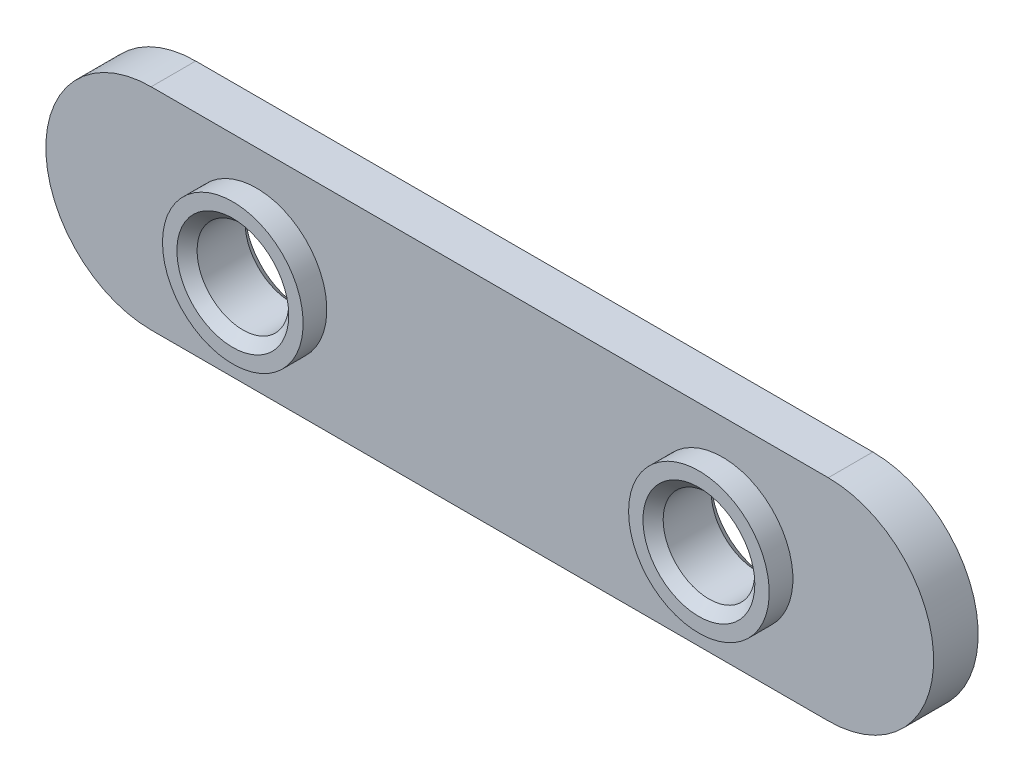
ISO-10303-21;
HEADER;
FILE_DESCRIPTION(('STEP AP214'),'2;1');
FILE_NAME('part.step','',(''),(''),'','','');
FILE_SCHEMA(('AUTOMOTIVE_DESIGN { 1 0 10303 214 1 1 1 1 }'));
ENDSEC;
DATA;
#1=APPLICATION_CONTEXT('core data for automotive mechanical design processes');
#2=APPLICATION_PROTOCOL_DEFINITION('international standard','automotive_design',2000,#1);
#3=PRODUCT_CONTEXT('',#1,'mechanical');
#4=PRODUCT('Part','Part','',(#3));
#5=PRODUCT_RELATED_PRODUCT_CATEGORY('part','',(#4));
#6=PRODUCT_DEFINITION_FORMATION('','',#4);
#7=PRODUCT_DEFINITION_CONTEXT('part definition',#1,'design');
#8=PRODUCT_DEFINITION('design','',#6,#7);
#9=PRODUCT_DEFINITION_SHAPE('','',#8);
#10=(LENGTH_UNIT() NAMED_UNIT(*) SI_UNIT(.MILLI.,.METRE.));
#11=(NAMED_UNIT(*) PLANE_ANGLE_UNIT() SI_UNIT($,.RADIAN.));
#12=(NAMED_UNIT(*) SI_UNIT($,.STERADIAN.) SOLID_ANGLE_UNIT());
#13=UNCERTAINTY_MEASURE_WITH_UNIT(LENGTH_MEASURE(1.E-05),#10,'distance_accuracy_value','');
#14=(GEOMETRIC_REPRESENTATION_CONTEXT(3) GLOBAL_UNCERTAINTY_ASSIGNED_CONTEXT((#13)) GLOBAL_UNIT_ASSIGNED_CONTEXT((#10,
#11,#12)) REPRESENTATION_CONTEXT('',''));
#15=CARTESIAN_POINT('',(0.,0.,0.));
#16=DIRECTION('',(0.,0.,1.));
#17=DIRECTION('',(1.,0.,0.));
#18=AXIS2_PLACEMENT_3D('',#15,#16,#17);
#19=CARTESIAN_POINT('',(28.7719,0.,2.465));
#20=DIRECTION('',(0.,0.,-1.));
#21=DIRECTION('',(-1.,0.,0.));
#22=AXIS2_PLACEMENT_3D('',#19,#20,#21);
#23=PLANE('',#22);
#24=CARTESIAN_POINT('',(25.,0.,2.465));
#25=DIRECTION('',(0.,0.,-1.));
#26=DIRECTION('',(-1.,0.,0.));
#27=AXIS2_PLACEMENT_3D('',#24,#25,#26);
#28=CIRCLE('',#27,3.7719);
#29=CARTESIAN_POINT('',(21.2281,0.,2.465));
#30=VERTEX_POINT('',#29);
#31=EDGE_CURVE('E124',#30,#30,#28,.T.);
#32=ORIENTED_EDGE('',*,*,#31,.F.);
#33=EDGE_LOOP('',(#32));
#34=FACE_BOUND('',#33,.T.);
#35=CARTESIAN_POINT('',(25.,0.,2.46499999991556));
#36=DIRECTION('',(0.,0.,1.));
#37=DIRECTION('',(1.,0.,0.));
#38=AXIS2_PLACEMENT_3D('',#35,#36,#37);
#39=CIRCLE('',#38,2.99999999996316);
#40=CARTESIAN_POINT('',(27.9999999999632,0.,2.46499999991556));
#41=VERTEX_POINT('',#40);
#42=EDGE_CURVE('E19',#41,#41,#39,.F.);
#43=ORIENTED_EDGE('',*,*,#42,.T.);
#44=EDGE_LOOP('',(#43));
#45=FACE_BOUND('',#44,.T.);
#46=ADVANCED_FACE('F16',(#34,#45),#23,.F.);
#47=CARTESIAN_POINT('',(3.7719,0.,2.465));
#48=DIRECTION('',(0.,0.,-1.));
#49=DIRECTION('',(-1.,0.,0.));
#50=AXIS2_PLACEMENT_3D('',#47,#48,#49);
#51=PLANE('',#50);
#52=CARTESIAN_POINT('',(0.,0.,2.465));
#53=DIRECTION('',(0.,0.,-1.));
#54=DIRECTION('',(-1.,0.,0.));
#55=AXIS2_PLACEMENT_3D('',#52,#53,#54);
#56=CIRCLE('',#55,3.7719);
#57=CARTESIAN_POINT('',(-3.7719,0.,2.465));
#58=VERTEX_POINT('',#57);
#59=EDGE_CURVE('E104',#58,#58,#56,.T.);
#60=ORIENTED_EDGE('',*,*,#59,.F.);
#61=EDGE_LOOP('',(#60));
#62=FACE_BOUND('',#61,.T.);
#63=CARTESIAN_POINT('',(0.,0.,2.46499999997241));
#64=DIRECTION('',(0.,0.,1.));
#65=DIRECTION('',(1.,0.,0.));
#66=AXIS2_PLACEMENT_3D('',#63,#64,#65);
#67=CIRCLE('',#66,3.00000000004275);
#68=CARTESIAN_POINT('',(3.00000000004275,0.,2.46499999997241));
#69=VERTEX_POINT('',#68);
#70=EDGE_CURVE('E126',#69,#69,#67,.F.);
#71=ORIENTED_EDGE('',*,*,#70,.T.);
#72=EDGE_LOOP('',(#71));
#73=FACE_BOUND('',#72,.T.);
#74=ADVANCED_FACE('F137',(#62,#73),#51,.F.);
#75=CARTESIAN_POINT('',(25.,0.,2.46499999985872));
#76=DIRECTION('',(0.,0.,1.));
#77=DIRECTION('',(1.,0.,0.));
#78=AXIS2_PLACEMENT_3D('',#75,#76,#77);
#79=CONICAL_SURFACE('',#78,2.99999999990632,0.785398163397448);
#80=CARTESIAN_POINT('',(25.,0.,1.9235));
#81=DIRECTION('',(0.,0.,-1.));
#82=DIRECTION('',(-1.,0.,0.));
#83=AXIS2_PLACEMENT_3D('',#80,#81,#82);
#84=CIRCLE('',#83,2.4585);
#85=CARTESIAN_POINT('',(22.5415,0.,1.9235));
#86=VERTEX_POINT('',#85);
#87=EDGE_CURVE('E99',#86,#86,#84,.T.);
#88=ORIENTED_EDGE('',*,*,#87,.T.);
#89=EDGE_LOOP('',(#88));
#90=FACE_BOUND('',#89,.T.);
#91=ORIENTED_EDGE('',*,*,#42,.F.);
#92=EDGE_LOOP('',(#91));
#93=FACE_BOUND('',#92,.T.);
#94=ADVANCED_FACE('F134',(#90,#93),#79,.F.);
#95=CARTESIAN_POINT('',(0.,0.,2.46499999985872));
#96=DIRECTION('',(0.,0.,1.));
#97=DIRECTION('',(1.,0.,0.));
#98=AXIS2_PLACEMENT_3D('',#95,#96,#97);
#99=CONICAL_SURFACE('',#98,2.99999999992906,0.785398163397448);
#100=CARTESIAN_POINT('',(0.,0.,1.9235));
#101=DIRECTION('',(0.,0.,-1.));
#102=DIRECTION('',(-1.,0.,0.));
#103=AXIS2_PLACEMENT_3D('',#100,#101,#102);
#104=CIRCLE('',#103,2.4585);
#105=CARTESIAN_POINT('',(-2.4585,0.,1.9235));
#106=VERTEX_POINT('',#105);
#107=EDGE_CURVE('E95',#106,#106,#104,.T.);
#108=ORIENTED_EDGE('',*,*,#107,.T.);
#109=EDGE_LOOP('',(#108));
#110=FACE_BOUND('',#109,.T.);
#111=ORIENTED_EDGE('',*,*,#70,.F.);
#112=EDGE_LOOP('',(#111));
#113=FACE_BOUND('',#112,.T.);
#114=ADVANCED_FACE('F136',(#110,#113),#99,.F.);
#115=CARTESIAN_POINT('',(25.,0.,2.465));
#116=DIRECTION('',(0.,0.,-1.));
#117=DIRECTION('',(-1.,0.,0.));
#118=AXIS2_PLACEMENT_3D('',#115,#116,#117);
#119=CYLINDRICAL_SURFACE('',#118,3.7719);
#120=CARTESIAN_POINT('',(25.,0.,1.195));
#121=DIRECTION('',(0.,0.,-1.));
#122=DIRECTION('',(-1.,0.,0.));
#123=AXIS2_PLACEMENT_3D('',#120,#121,#122);
#124=CIRCLE('',#123,3.7719);
#125=CARTESIAN_POINT('',(21.2281,0.,1.195));
#126=VERTEX_POINT('',#125);
#127=EDGE_CURVE('E98',#126,#126,#124,.T.);
#128=ORIENTED_EDGE('',*,*,#127,.F.);
#129=EDGE_LOOP('',(#128));
#130=FACE_BOUND('',#129,.T.);
#131=ORIENTED_EDGE('',*,*,#31,.T.);
#132=EDGE_LOOP('',(#131));
#133=FACE_BOUND('',#132,.T.);
#134=ADVANCED_FACE('F145',(#130,#133),#119,.T.);
#135=CARTESIAN_POINT('',(0.,0.,2.465));
#136=DIRECTION('',(0.,0.,-1.));
#137=DIRECTION('',(-1.,0.,0.));
#138=AXIS2_PLACEMENT_3D('',#135,#136,#137);
#139=CYLINDRICAL_SURFACE('',#138,3.7719);
#140=CARTESIAN_POINT('',(0.,0.,1.195));
#141=DIRECTION('',(0.,0.,-1.));
#142=DIRECTION('',(-1.,0.,0.));
#143=AXIS2_PLACEMENT_3D('',#140,#141,#142);
#144=CIRCLE('',#143,3.7719);
#145=CARTESIAN_POINT('',(-3.7719,0.,1.195));
#146=VERTEX_POINT('',#145);
#147=EDGE_CURVE('E90',#146,#146,#144,.T.);
#148=ORIENTED_EDGE('',*,*,#147,.F.);
#149=EDGE_LOOP('',(#148));
#150=FACE_BOUND('',#149,.T.);
#151=ORIENTED_EDGE('',*,*,#59,.T.);
#152=EDGE_LOOP('',(#151));
#153=FACE_BOUND('',#152,.T.);
#154=ADVANCED_FACE('F186',(#150,#153),#139,.T.);
#155=CARTESIAN_POINT('',(25.,0.,2.465));
#156=DIRECTION('',(0.,0.,-1.));
#157=DIRECTION('',(-1.,0.,0.));
#158=AXIS2_PLACEMENT_3D('',#155,#156,#157);
#159=CYLINDRICAL_SURFACE('',#158,2.4585);
#160=CARTESIAN_POINT('',(25.,0.,-0.653499999941687));
#161=DIRECTION('',(0.,0.,-1.));
#162=DIRECTION('',(-1.,0.,0.));
#163=AXIS2_PLACEMENT_3D('',#160,#161,#162);
#164=CIRCLE('',#163,2.45850000001156);
#165=CARTESIAN_POINT('',(22.5414999999884,0.,-0.653499999941687));
#166=VERTEX_POINT('',#165);
#167=EDGE_CURVE('E85',#166,#166,#164,.T.);
#168=ORIENTED_EDGE('',*,*,#167,.T.);
#169=EDGE_LOOP('',(#168));
#170=FACE_BOUND('',#169,.T.);
#171=ORIENTED_EDGE('',*,*,#87,.F.);
#172=EDGE_LOOP('',(#171));
#173=FACE_BOUND('',#172,.T.);
#174=ADVANCED_FACE('F182',(#170,#173),#159,.F.);
#175=CARTESIAN_POINT('',(0.,0.,2.465));
#176=DIRECTION('',(0.,0.,-1.));
#177=DIRECTION('',(-1.,0.,0.));
#178=AXIS2_PLACEMENT_3D('',#175,#176,#177);
#179=CYLINDRICAL_SURFACE('',#178,2.4585);
#180=CARTESIAN_POINT('',(0.,0.,-0.65349999999853));
#181=DIRECTION('',(0.,0.,-1.));
#182=DIRECTION('',(-1.,0.,0.));
#183=AXIS2_PLACEMENT_3D('',#180,#181,#182);
#184=CIRCLE('',#183,2.45850000004566);
#185=CARTESIAN_POINT('',(-2.45850000004566,0.,-0.65349999999853));
#186=VERTEX_POINT('',#185);
#187=EDGE_CURVE('E67',#186,#186,#184,.T.);
#188=ORIENTED_EDGE('',*,*,#187,.T.);
#189=EDGE_LOOP('',(#188));
#190=FACE_BOUND('',#189,.T.);
#191=ORIENTED_EDGE('',*,*,#107,.F.);
#192=EDGE_LOOP('',(#191));
#193=FACE_BOUND('',#192,.T.);
#194=ADVANCED_FACE('F179',(#190,#193),#179,.F.);
#195=CARTESIAN_POINT('',(-5.65,0.,1.195));
#196=DIRECTION('',(0.,0.,1.));
#197=DIRECTION('',(1.,0.,0.));
#198=AXIS2_PLACEMENT_3D('',#195,#196,#197);
#199=PLANE('',#198);
#200=DIRECTION('',(1.,0.,0.));
#201=VECTOR('',#200,1.);
#202=CARTESIAN_POINT('',(-5.65,-5.65,1.195));
#203=LINE('',#202,#201);
#204=CARTESIAN_POINT('',(-5.65,-5.65,1.195));
#205=VERTEX_POINT('',#204);
#206=CARTESIAN_POINT('',(30.67,-5.65,1.195));
#207=VERTEX_POINT('',#206);
#208=EDGE_CURVE('E59',#205,#207,#203,.T.);
#209=ORIENTED_EDGE('',*,*,#208,.T.);
#210=CARTESIAN_POINT('',(30.67,0.,1.195));
#211=DIRECTION('',(0.,0.,1.));
#212=DIRECTION('',(1.,0.,0.));
#213=AXIS2_PLACEMENT_3D('',#210,#211,#212);
#214=CIRCLE('',#213,5.65);
#215=CARTESIAN_POINT('',(30.67,5.65,1.195));
#216=VERTEX_POINT('',#215);
#217=EDGE_CURVE('E74',#216,#207,#214,.F.);
#218=ORIENTED_EDGE('',*,*,#217,.F.);
#219=DIRECTION('',(1.,0.,0.));
#220=VECTOR('',#219,1.);
#221=CARTESIAN_POINT('',(30.67,5.65,1.195));
#222=LINE('',#221,#220);
#223=CARTESIAN_POINT('',(-5.65,5.65,1.195));
#224=VERTEX_POINT('',#223);
#225=EDGE_CURVE('E61',#216,#224,#222,.F.);
#226=ORIENTED_EDGE('',*,*,#225,.T.);
#227=CARTESIAN_POINT('',(-5.65,0.,1.195));
#228=DIRECTION('',(0.,0.,1.));
#229=DIRECTION('',(1.,0.,0.));
#230=AXIS2_PLACEMENT_3D('',#227,#228,#229);
#231=CIRCLE('',#230,5.65);
#232=EDGE_CURVE('E55',#205,#224,#231,.F.);
#233=ORIENTED_EDGE('',*,*,#232,.F.);
#234=EDGE_LOOP('',(#209,#218,#226,#233));
#235=FACE_BOUND('',#234,.T.);
#236=ORIENTED_EDGE('',*,*,#147,.T.);
#237=EDGE_LOOP('',(#236));
#238=FACE_BOUND('',#237,.T.);
#239=ORIENTED_EDGE('',*,*,#127,.T.);
#240=EDGE_LOOP('',(#239));
#241=FACE_BOUND('',#240,.T.);
#242=ADVANCED_FACE('F57',(#235,#238,#241),#199,.T.);
#243=CARTESIAN_POINT('',(25.,0.,-1.19499999988193));
#244=DIRECTION('',(0.,0.,-1.));
#245=DIRECTION('',(-1.,0.,0.));
#246=AXIS2_PLACEMENT_3D('',#243,#244,#245);
#247=CONICAL_SURFACE('',#246,2.99999999989495,0.785398163344961);
#248=CARTESIAN_POINT('',(25.,0.,-1.19499999993877));
#249=DIRECTION('',(0.,0.,-1.));
#250=DIRECTION('',(-1.,0.,0.));
#251=AXIS2_PLACEMENT_3D('',#248,#249,#250);
#252=CIRCLE('',#251,2.9999999999518);
#253=CARTESIAN_POINT('',(22.0000000000482,0.,-1.19499999993877));
#254=VERTEX_POINT('',#253);
#255=EDGE_CURVE('E114',#254,#254,#252,.T.);
#256=ORIENTED_EDGE('',*,*,#255,.T.);
#257=EDGE_LOOP('',(#256));
#258=FACE_BOUND('',#257,.T.);
#259=ORIENTED_EDGE('',*,*,#167,.F.);
#260=EDGE_LOOP('',(#259));
#261=FACE_BOUND('',#260,.T.);
#262=ADVANCED_FACE('F172',(#258,#261),#247,.F.);
#263=CARTESIAN_POINT('',(0.,0.,-1.19500000005246));
#264=DIRECTION('',(0.,0.,-1.));
#265=DIRECTION('',(-1.,0.,0.));
#266=AXIS2_PLACEMENT_3D('',#263,#264,#265);
#267=CONICAL_SURFACE('',#266,3.00000000009959,0.785398163397448);
#268=CARTESIAN_POINT('',(0.,0.,-1.19499999999562));
#269=DIRECTION('',(0.,0.,-1.));
#270=DIRECTION('',(-1.,0.,0.));
#271=AXIS2_PLACEMENT_3D('',#268,#269,#270);
#272=CIRCLE('',#271,3.00000000004275);
#273=CARTESIAN_POINT('',(-3.00000000004275,0.,-1.19499999999562));
#274=VERTEX_POINT('',#273);
#275=EDGE_CURVE('E111',#274,#274,#272,.T.);
#276=ORIENTED_EDGE('',*,*,#275,.T.);
#277=EDGE_LOOP('',(#276));
#278=FACE_BOUND('',#277,.T.);
#279=ORIENTED_EDGE('',*,*,#187,.F.);
#280=EDGE_LOOP('',(#279));
#281=FACE_BOUND('',#280,.T.);
#282=ADVANCED_FACE('F169',(#278,#281),#267,.F.);
#283=CARTESIAN_POINT('',(-5.65,0.,1.195));
#284=DIRECTION('',(0.,0.,1.));
#285=DIRECTION('',(1.,0.,0.));
#286=AXIS2_PLACEMENT_3D('',#283,#284,#285);
#287=CYLINDRICAL_SURFACE('',#286,5.65);
#288=ORIENTED_EDGE('',*,*,#232,.T.);
#289=DIRECTION('',(0.,0.,-1.));
#290=VECTOR('',#289,1.);
#291=CARTESIAN_POINT('',(-5.65,5.65,1.195));
#292=LINE('',#291,#290);
#293=CARTESIAN_POINT('',(-5.65,5.65,-1.195));
#294=VERTEX_POINT('',#293);
#295=EDGE_CURVE('E93',#224,#294,#292,.T.);
#296=ORIENTED_EDGE('',*,*,#295,.T.);
#297=CARTESIAN_POINT('',(-5.65,0.,-1.195));
#298=DIRECTION('',(0.,0.,1.));
#299=DIRECTION('',(1.,0.,0.));
#300=AXIS2_PLACEMENT_3D('',#297,#298,#299);
#301=CIRCLE('',#300,5.65);
#302=CARTESIAN_POINT('',(-5.65,-5.65,-1.195));
#303=VERTEX_POINT('',#302);
#304=EDGE_CURVE('E78',#294,#303,#301,.T.);
#305=ORIENTED_EDGE('',*,*,#304,.T.);
#306=DIRECTION('',(0.,0.,1.));
#307=VECTOR('',#306,1.);
#308=CARTESIAN_POINT('',(-5.65,-5.65,1.195));
#309=LINE('',#308,#307);
#310=EDGE_CURVE('E66',#303,#205,#309,.T.);
#311=ORIENTED_EDGE('',*,*,#310,.T.);
#312=EDGE_LOOP('',(#288,#296,#305,#311));
#313=FACE_BOUND('',#312,.T.);
#314=ADVANCED_FACE('F77',(#313),#287,.T.);
#315=CARTESIAN_POINT('',(-5.65,-5.65,1.195));
#316=DIRECTION('',(0.,1.,0.));
#317=DIRECTION('',(0.,0.,1.));
#318=AXIS2_PLACEMENT_3D('',#315,#316,#317);
#319=PLANE('',#318);
#320=DIRECTION('',(0.,0.,1.));
#321=VECTOR('',#320,1.);
#322=CARTESIAN_POINT('',(30.67,-5.65,1.195));
#323=LINE('',#322,#321);
#324=CARTESIAN_POINT('',(30.67,-5.65,-1.195));
#325=VERTEX_POINT('',#324);
#326=EDGE_CURVE('E73',#207,#325,#323,.F.);
#327=ORIENTED_EDGE('',*,*,#326,.F.);
#328=ORIENTED_EDGE('',*,*,#208,.F.);
#329=ORIENTED_EDGE('',*,*,#310,.F.);
#330=DIRECTION('',(1.,0.,0.));
#331=VECTOR('',#330,1.);
#332=CARTESIAN_POINT('',(-5.65,-5.65,-1.195));
#333=LINE('',#332,#331);
#334=EDGE_CURVE('E109',#303,#325,#333,.T.);
#335=ORIENTED_EDGE('',*,*,#334,.T.);
#336=EDGE_LOOP('',(#327,#328,#329,#335));
#337=FACE_BOUND('',#336,.T.);
#338=ADVANCED_FACE('F70',(#337),#319,.F.);
#339=CARTESIAN_POINT('',(30.67,0.,1.195));
#340=DIRECTION('',(0.,0.,1.));
#341=DIRECTION('',(1.,0.,0.));
#342=AXIS2_PLACEMENT_3D('',#339,#340,#341);
#343=CYLINDRICAL_SURFACE('',#342,5.65);
#344=ORIENTED_EDGE('',*,*,#217,.T.);
#345=ORIENTED_EDGE('',*,*,#326,.T.);
#346=CARTESIAN_POINT('',(30.67,0.,-1.195));
#347=DIRECTION('',(0.,0.,1.));
#348=DIRECTION('',(1.,0.,0.));
#349=AXIS2_PLACEMENT_3D('',#346,#347,#348);
#350=CIRCLE('',#349,5.65);
#351=CARTESIAN_POINT('',(30.67,5.65,-1.195));
#352=VERTEX_POINT('',#351);
#353=EDGE_CURVE('E25',#325,#352,#350,.T.);
#354=ORIENTED_EDGE('',*,*,#353,.T.);
#355=DIRECTION('',(0.,0.,-1.));
#356=VECTOR('',#355,1.);
#357=CARTESIAN_POINT('',(30.67,5.65,1.195));
#358=LINE('',#357,#356);
#359=EDGE_CURVE('E33',#352,#216,#358,.F.);
#360=ORIENTED_EDGE('',*,*,#359,.T.);
#361=EDGE_LOOP('',(#344,#345,#354,#360));
#362=FACE_BOUND('',#361,.T.);
#363=ADVANCED_FACE('F157',(#362),#343,.T.);
#364=CARTESIAN_POINT('',(30.67,5.65,1.195));
#365=DIRECTION('',(0.,-1.,0.));
#366=DIRECTION('',(0.,0.,-1.));
#367=AXIS2_PLACEMENT_3D('',#364,#365,#366);
#368=PLANE('',#367);
#369=ORIENTED_EDGE('',*,*,#295,.F.);
#370=ORIENTED_EDGE('',*,*,#225,.F.);
#371=ORIENTED_EDGE('',*,*,#359,.F.);
#372=DIRECTION('',(1.,0.,0.));
#373=VECTOR('',#372,1.);
#374=CARTESIAN_POINT('',(-5.65,5.65,-1.195));
#375=LINE('',#374,#373);
#376=EDGE_CURVE('E10',#352,#294,#375,.F.);
#377=ORIENTED_EDGE('',*,*,#376,.T.);
#378=EDGE_LOOP('',(#369,#370,#371,#377));
#379=FACE_BOUND('',#378,.T.);
#380=ADVANCED_FACE('F151',(#379),#368,.F.);
#381=CARTESIAN_POINT('',(-5.65,0.,-1.195));
#382=DIRECTION('',(0.,0.,1.));
#383=DIRECTION('',(1.,0.,0.));
#384=AXIS2_PLACEMENT_3D('',#381,#382,#383);
#385=PLANE('',#384);
#386=ORIENTED_EDGE('',*,*,#353,.F.);
#387=ORIENTED_EDGE('',*,*,#334,.F.);
#388=ORIENTED_EDGE('',*,*,#304,.F.);
#389=ORIENTED_EDGE('',*,*,#376,.F.);
#390=EDGE_LOOP('',(#386,#387,#388,#389));
#391=FACE_BOUND('',#390,.T.);
#392=ORIENTED_EDGE('',*,*,#275,.F.);
#393=EDGE_LOOP('',(#392));
#394=FACE_BOUND('',#393,.T.);
#395=ORIENTED_EDGE('',*,*,#255,.F.);
#396=EDGE_LOOP('',(#395));
#397=FACE_BOUND('',#396,.T.);
#398=ADVANCED_FACE('F149',(#391,#394,#397),#385,.F.);
#399=CLOSED_SHELL('',(#46,#74,#94,#114,#134,#154,#174,#194,#242,#262,#282,#314,#338,#363,#380,#398));
#400=MANIFOLD_SOLID_BREP('B1',#399);
#401=ADVANCED_BREP_SHAPE_REPRESENTATION('',(#18,#400),#14);
#402=SHAPE_DEFINITION_REPRESENTATION(#9,#401);
ENDSEC;
END-ISO-10303-21;
